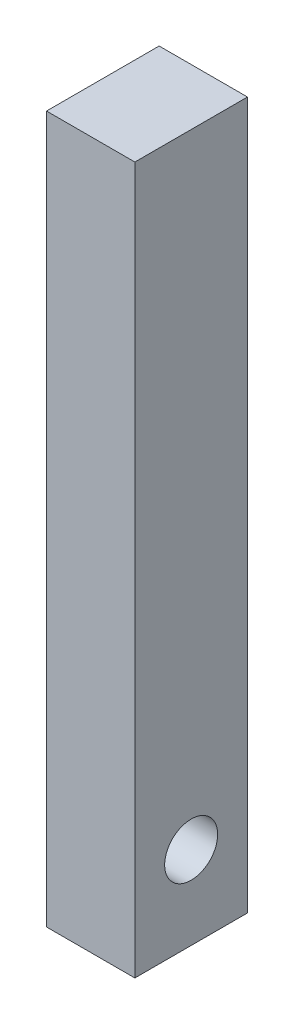
ISO-10303-21;
HEADER;
FILE_DESCRIPTION(('STEP AP214'),'2;1');
FILE_NAME('part.step','',(''),(''),'','','');
FILE_SCHEMA(('AUTOMOTIVE_DESIGN { 1 0 10303 214 1 1 1 1 }'));
ENDSEC;
DATA;
#1=APPLICATION_CONTEXT('core data for automotive mechanical design processes');
#2=APPLICATION_PROTOCOL_DEFINITION('international standard','automotive_design',2000,#1);
#3=PRODUCT_CONTEXT('',#1,'mechanical');
#4=PRODUCT('Part','Part','',(#3));
#5=PRODUCT_RELATED_PRODUCT_CATEGORY('part','',(#4));
#6=PRODUCT_DEFINITION_FORMATION('','',#4);
#7=PRODUCT_DEFINITION_CONTEXT('part definition',#1,'design');
#8=PRODUCT_DEFINITION('design','',#6,#7);
#9=PRODUCT_DEFINITION_SHAPE('','',#8);
#10=(LENGTH_UNIT() NAMED_UNIT(*) SI_UNIT(.MILLI.,.METRE.));
#11=(NAMED_UNIT(*) PLANE_ANGLE_UNIT() SI_UNIT($,.RADIAN.));
#12=(NAMED_UNIT(*) SI_UNIT($,.STERADIAN.) SOLID_ANGLE_UNIT());
#13=UNCERTAINTY_MEASURE_WITH_UNIT(LENGTH_MEASURE(1.E-05),#10,'distance_accuracy_value','');
#14=(GEOMETRIC_REPRESENTATION_CONTEXT(3) GLOBAL_UNCERTAINTY_ASSIGNED_CONTEXT((#13)) GLOBAL_UNIT_ASSIGNED_CONTEXT((#10,
#11,#12)) REPRESENTATION_CONTEXT('',''));
#15=CARTESIAN_POINT('',(0.,0.,0.));
#16=DIRECTION('',(0.,0.,1.));
#17=DIRECTION('',(1.,0.,0.));
#18=AXIS2_PLACEMENT_3D('',#15,#16,#17);
#19=CARTESIAN_POINT('',(-5.94931652313311,14.0025323621038,12.75));
#20=DIRECTION('',(-1.,0.,0.));
#21=DIRECTION('',(0.,0.,1.));
#22=AXIS2_PLACEMENT_3D('',#19,#20,#21);
#23=PLANE('',#22);
#24=CARTESIAN_POINT('',(-5.94931652313311,-56.5974676378962,6.375));
#25=DIRECTION('',(1.,0.,0.));
#26=DIRECTION('',(0.,0.,-1.));
#27=AXIS2_PLACEMENT_3D('',#24,#25,#26);
#28=CIRCLE('',#27,3.);
#29=CARTESIAN_POINT('',(-5.94931652313311,-56.5974676378962,3.375));
#30=VERTEX_POINT('',#29);
#31=EDGE_CURVE('E113',#30,#30,#28,.T.);
#32=ORIENTED_EDGE('',*,*,#31,.F.);
#33=EDGE_LOOP('',(#32));
#34=FACE_BOUND('',#33,.T.);
#35=DIRECTION('',(0.,1.,0.));
#36=VECTOR('',#35,1.);
#37=CARTESIAN_POINT('',(-5.94931652313311,14.0025323621038,0.));
#38=LINE('',#37,#36);
#39=CARTESIAN_POINT('',(-5.94931652313311,-65.9974676378962,0.));
#40=VERTEX_POINT('',#39);
#41=CARTESIAN_POINT('',(-5.94931652313311,14.0025323621038,0.));
#42=VERTEX_POINT('',#41);
#43=EDGE_CURVE('E97',#40,#42,#38,.T.);
#44=ORIENTED_EDGE('',*,*,#43,.T.);
#45=DIRECTION('',(0.,0.,-1.));
#46=VECTOR('',#45,1.);
#47=CARTESIAN_POINT('',(-5.94931652313311,14.0025323621038,12.75));
#48=LINE('',#47,#46);
#49=CARTESIAN_POINT('',(-5.94931652313311,14.0025323621038,12.75));
#50=VERTEX_POINT('',#49);
#51=EDGE_CURVE('E11',#50,#42,#48,.T.);
#52=ORIENTED_EDGE('',*,*,#51,.F.);
#53=DIRECTION('',(0.,1.,0.));
#54=VECTOR('',#53,1.);
#55=CARTESIAN_POINT('',(-5.94931652313311,14.0025323621038,12.75));
#56=LINE('',#55,#54);
#57=CARTESIAN_POINT('',(-5.94931652313311,-65.9974676378962,12.75));
#58=VERTEX_POINT('',#57);
#59=EDGE_CURVE('E85',#58,#50,#56,.T.);
#60=ORIENTED_EDGE('',*,*,#59,.F.);
#61=DIRECTION('',(0.,0.,-1.));
#62=VECTOR('',#61,1.);
#63=CARTESIAN_POINT('',(-5.94931652313311,-65.9974676378962,12.75));
#64=LINE('',#63,#62);
#65=EDGE_CURVE('E93',#58,#40,#64,.T.);
#66=ORIENTED_EDGE('',*,*,#65,.T.);
#67=EDGE_LOOP('',(#44,#52,#60,#66));
#68=FACE_BOUND('',#67,.T.);
#69=ADVANCED_FACE('F34',(#34,#68),#23,.F.);
#70=CARTESIAN_POINT('',(-5.94931652313311,14.0025323621038,12.75));
#71=DIRECTION('',(0.,-1.,0.));
#72=DIRECTION('',(0.,0.,-1.));
#73=AXIS2_PLACEMENT_3D('',#70,#71,#72);
#74=PLANE('',#73);
#75=DIRECTION('',(-1.,0.,0.));
#76=VECTOR('',#75,1.);
#77=CARTESIAN_POINT('',(-5.94931652313311,14.0025323621038,0.));
#78=LINE('',#77,#76);
#79=CARTESIAN_POINT('',(-15.9493165231331,14.0025323621038,0.));
#80=VERTEX_POINT('',#79);
#81=EDGE_CURVE('E89',#42,#80,#78,.T.);
#82=ORIENTED_EDGE('',*,*,#81,.T.);
#83=DIRECTION('',(0.,0.,-1.));
#84=VECTOR('',#83,1.);
#85=CARTESIAN_POINT('',(-15.9493165231331,14.0025323621038,12.75));
#86=LINE('',#85,#84);
#87=CARTESIAN_POINT('',(-15.9493165231331,14.0025323621038,12.75));
#88=VERTEX_POINT('',#87);
#89=EDGE_CURVE('E42',#88,#80,#86,.T.);
#90=ORIENTED_EDGE('',*,*,#89,.F.);
#91=DIRECTION('',(-1.,0.,0.));
#92=VECTOR('',#91,1.);
#93=CARTESIAN_POINT('',(-5.94931652313311,14.0025323621038,12.75));
#94=LINE('',#93,#92);
#95=EDGE_CURVE('E80',#50,#88,#94,.T.);
#96=ORIENTED_EDGE('',*,*,#95,.F.);
#97=ORIENTED_EDGE('',*,*,#51,.T.);
#98=EDGE_LOOP('',(#82,#90,#96,#97));
#99=FACE_BOUND('',#98,.T.);
#100=ADVANCED_FACE('F88',(#99),#74,.F.);
#101=CARTESIAN_POINT('',(-15.9493165231331,14.0025323621038,12.75));
#102=DIRECTION('',(1.,0.,0.));
#103=DIRECTION('',(0.,1.,0.));
#104=AXIS2_PLACEMENT_3D('',#101,#102,#103);
#105=PLANE('',#104);
#106=CARTESIAN_POINT('',(-15.9493165231331,-56.5974676378962,6.375));
#107=DIRECTION('',(1.,0.,0.));
#108=DIRECTION('',(0.,1.,0.));
#109=AXIS2_PLACEMENT_3D('',#106,#107,#108);
#110=CIRCLE('',#109,3.);
#111=CARTESIAN_POINT('',(-15.9493165231331,-53.5974676378962,6.375));
#112=VERTEX_POINT('',#111);
#113=EDGE_CURVE('E100',#112,#112,#110,.T.);
#114=ORIENTED_EDGE('',*,*,#113,.T.);
#115=EDGE_LOOP('',(#114));
#116=FACE_BOUND('',#115,.T.);
#117=DIRECTION('',(0.,-1.,0.));
#118=VECTOR('',#117,1.);
#119=CARTESIAN_POINT('',(-15.9493165231331,14.0025323621038,0.));
#120=LINE('',#119,#118);
#121=CARTESIAN_POINT('',(-15.9493165231331,-65.9974676378962,0.));
#122=VERTEX_POINT('',#121);
#123=EDGE_CURVE('E67',#80,#122,#120,.T.);
#124=ORIENTED_EDGE('',*,*,#123,.T.);
#125=DIRECTION('',(0.,0.,-1.));
#126=VECTOR('',#125,1.);
#127=CARTESIAN_POINT('',(-15.9493165231331,-65.9974676378962,12.75));
#128=LINE('',#127,#126);
#129=CARTESIAN_POINT('',(-15.9493165231331,-65.9974676378962,12.75));
#130=VERTEX_POINT('',#129);
#131=EDGE_CURVE('E90',#130,#122,#128,.T.);
#132=ORIENTED_EDGE('',*,*,#131,.F.);
#133=DIRECTION('',(0.,-1.,0.));
#134=VECTOR('',#133,1.);
#135=CARTESIAN_POINT('',(-15.9493165231331,14.0025323621038,12.75));
#136=LINE('',#135,#134);
#137=EDGE_CURVE('E83',#88,#130,#136,.T.);
#138=ORIENTED_EDGE('',*,*,#137,.F.);
#139=ORIENTED_EDGE('',*,*,#89,.T.);
#140=EDGE_LOOP('',(#124,#132,#138,#139));
#141=FACE_BOUND('',#140,.T.);
#142=ADVANCED_FACE('F91',(#116,#141),#105,.F.);
#143=CARTESIAN_POINT('',(-5.94931652313311,-65.9974676378962,12.75));
#144=DIRECTION('',(0.,1.,0.));
#145=DIRECTION('',(0.,0.,1.));
#146=AXIS2_PLACEMENT_3D('',#143,#144,#145);
#147=PLANE('',#146);
#148=DIRECTION('',(1.,0.,0.));
#149=VECTOR('',#148,1.);
#150=CARTESIAN_POINT('',(-5.94931652313311,-65.9974676378962,0.));
#151=LINE('',#150,#149);
#152=EDGE_CURVE('E73',#122,#40,#151,.T.);
#153=ORIENTED_EDGE('',*,*,#152,.T.);
#154=ORIENTED_EDGE('',*,*,#65,.F.);
#155=DIRECTION('',(1.,0.,0.));
#156=VECTOR('',#155,1.);
#157=CARTESIAN_POINT('',(-5.94931652313311,-65.9974676378962,12.75));
#158=LINE('',#157,#156);
#159=EDGE_CURVE('E50',#130,#58,#158,.T.);
#160=ORIENTED_EDGE('',*,*,#159,.F.);
#161=ORIENTED_EDGE('',*,*,#131,.T.);
#162=EDGE_LOOP('',(#153,#154,#160,#161));
#163=FACE_BOUND('',#162,.T.);
#164=ADVANCED_FACE('F105',(#163),#147,.F.);
#165=CARTESIAN_POINT('',(0.,0.,12.75));
#166=DIRECTION('',(0.,0.,-1.));
#167=DIRECTION('',(-1.,0.,0.));
#168=AXIS2_PLACEMENT_3D('',#165,#166,#167);
#169=PLANE('',#168);
#170=ORIENTED_EDGE('',*,*,#59,.T.);
#171=ORIENTED_EDGE('',*,*,#95,.T.);
#172=ORIENTED_EDGE('',*,*,#137,.T.);
#173=ORIENTED_EDGE('',*,*,#159,.T.);
#174=EDGE_LOOP('',(#170,#171,#172,#173));
#175=FACE_BOUND('',#174,.T.);
#176=ADVANCED_FACE('F81',(#175),#169,.F.);
#177=CARTESIAN_POINT('',(0.,0.,0.));
#178=DIRECTION('',(0.,0.,-1.));
#179=DIRECTION('',(-1.,0.,0.));
#180=AXIS2_PLACEMENT_3D('',#177,#178,#179);
#181=PLANE('',#180);
#182=ORIENTED_EDGE('',*,*,#43,.F.);
#183=ORIENTED_EDGE('',*,*,#152,.F.);
#184=ORIENTED_EDGE('',*,*,#123,.F.);
#185=ORIENTED_EDGE('',*,*,#81,.F.);
#186=EDGE_LOOP('',(#182,#183,#184,#185));
#187=FACE_BOUND('',#186,.T.);
#188=ADVANCED_FACE('F108',(#187),#181,.T.);
#189=CARTESIAN_POINT('',(-5.94931652313311,-56.5974676378962,6.375));
#190=DIRECTION('',(1.,0.,0.));
#191=DIRECTION('',(0.,0.,-1.));
#192=AXIS2_PLACEMENT_3D('',#189,#190,#191);
#193=CYLINDRICAL_SURFACE('',#192,3.);
#194=ORIENTED_EDGE('',*,*,#113,.F.);
#195=EDGE_LOOP('',(#194));
#196=FACE_BOUND('',#195,.T.);
#197=ORIENTED_EDGE('',*,*,#31,.T.);
#198=EDGE_LOOP('',(#197));
#199=FACE_BOUND('',#198,.T.);
#200=ADVANCED_FACE('F117',(#196,#199),#193,.F.);
#201=CLOSED_SHELL('',(#69,#100,#142,#164,#176,#188,#200));
#202=MANIFOLD_SOLID_BREP('B2',#201);
#203=ADVANCED_BREP_SHAPE_REPRESENTATION('',(#18,#202),#14);
#204=SHAPE_DEFINITION_REPRESENTATION(#9,#203);
ENDSEC;
END-ISO-10303-21;
